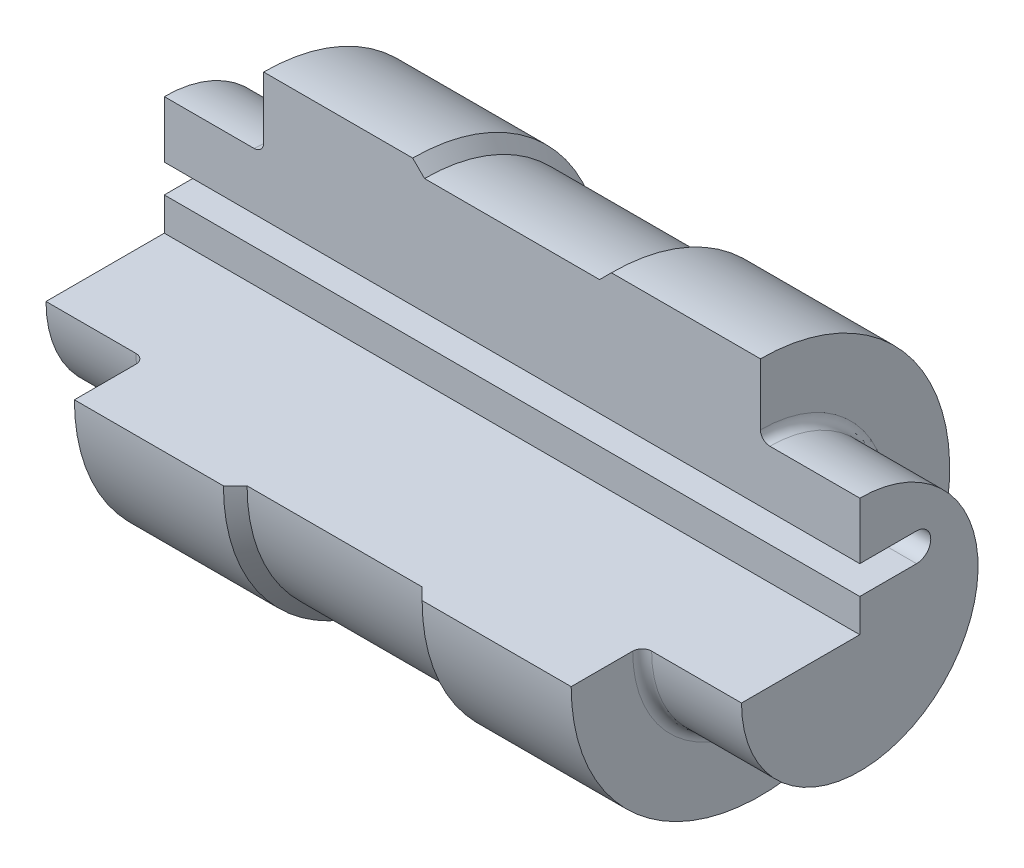
ISO-10303-21;
HEADER;
FILE_DESCRIPTION(('STEP AP214'),'2;1');
FILE_NAME('part.step','',(''),(''),'','','');
FILE_SCHEMA(('AUTOMOTIVE_DESIGN { 1 0 10303 214 1 1 1 1 }'));
ENDSEC;
DATA;
#1=APPLICATION_CONTEXT('core data for automotive mechanical design processes');
#2=APPLICATION_PROTOCOL_DEFINITION('international standard','automotive_design',2000,#1);
#3=PRODUCT_CONTEXT('',#1,'mechanical');
#4=PRODUCT('Part','Part','',(#3));
#5=PRODUCT_RELATED_PRODUCT_CATEGORY('part','',(#4));
#6=PRODUCT_DEFINITION_FORMATION('','',#4);
#7=PRODUCT_DEFINITION_CONTEXT('part definition',#1,'design');
#8=PRODUCT_DEFINITION('design','',#6,#7);
#9=PRODUCT_DEFINITION_SHAPE('','',#8);
#10=(LENGTH_UNIT() NAMED_UNIT(*) SI_UNIT(.MILLI.,.METRE.));
#11=(NAMED_UNIT(*) PLANE_ANGLE_UNIT() SI_UNIT($,.RADIAN.));
#12=(NAMED_UNIT(*) SI_UNIT($,.STERADIAN.) SOLID_ANGLE_UNIT());
#13=UNCERTAINTY_MEASURE_WITH_UNIT(LENGTH_MEASURE(1.E-05),#10,'distance_accuracy_value','');
#14=(GEOMETRIC_REPRESENTATION_CONTEXT(3) GLOBAL_UNCERTAINTY_ASSIGNED_CONTEXT((#13)) GLOBAL_UNIT_ASSIGNED_CONTEXT((#10,
#11,#12)) REPRESENTATION_CONTEXT('',''));
#15=CARTESIAN_POINT('',(0.,0.,0.));
#16=DIRECTION('',(0.,0.,1.));
#17=DIRECTION('',(1.,0.,0.));
#18=AXIS2_PLACEMENT_3D('',#15,#16,#17);
#19=CARTESIAN_POINT('',(0.,0.,0.));
#20=DIRECTION('',(0.,0.,-1.));
#21=DIRECTION('',(-1.,0.,0.));
#22=AXIS2_PLACEMENT_3D('',#19,#20,#21);
#23=PLANE('',#22);
#24=DIRECTION('',(0.,-1.,0.));
#25=VECTOR('',#24,1.);
#26=CARTESIAN_POINT('',(-117.728055077453,0.,0.));
#27=LINE('',#26,#25);
#28=CARTESIAN_POINT('',(-117.728055077453,25.,0.));
#29=VERTEX_POINT('',#28);
#30=CARTESIAN_POINT('',(-117.728055077453,13.,0.));
#31=VERTEX_POINT('',#30);
#32=EDGE_CURVE('E243',#29,#31,#27,.T.);
#33=ORIENTED_EDGE('',*,*,#32,.T.);
#34=DIRECTION('',(-1.,0.,0.));
#35=VECTOR('',#34,1.);
#36=CARTESIAN_POINT('',(29.2719449225473,13.,0.));
#37=LINE('',#36,#35);
#38=CARTESIAN_POINT('',(29.2719449225473,13.,0.));
#39=VERTEX_POINT('',#38);
#40=EDGE_CURVE('E194',#39,#31,#37,.T.);
#41=ORIENTED_EDGE('',*,*,#40,.F.);
#42=DIRECTION('',(0.,1.,0.));
#43=VECTOR('',#42,1.);
#44=CARTESIAN_POINT('',(29.2719449225473,25.,0.));
#45=LINE('',#44,#43);
#46=CARTESIAN_POINT('',(29.2719449225473,25.,0.));
#47=VERTEX_POINT('',#46);
#48=EDGE_CURVE('E207',#39,#47,#45,.T.);
#49=ORIENTED_EDGE('',*,*,#48,.T.);
#50=DIRECTION('',(-1.,0.,0.));
#51=VECTOR('',#50,1.);
#52=CARTESIAN_POINT('',(8.27194492254729,25.,0.));
#53=LINE('',#52,#51);
#54=CARTESIAN_POINT('',(10.2719449225473,25.,0.));
#55=VERTEX_POINT('',#54);
#56=EDGE_CURVE('E206',#47,#55,#53,.T.);
#57=ORIENTED_EDGE('',*,*,#56,.T.);
#58=CARTESIAN_POINT('',(10.2719449225473,27.,0.));
#59=DIRECTION('',(0.,0.,-1.));
#60=DIRECTION('',(-1.,0.,0.));
#61=AXIS2_PLACEMENT_3D('',#58,#59,#60);
#62=CIRCLE('',#61,2.);
#63=CARTESIAN_POINT('',(8.27194492254729,27.,0.));
#64=VERTEX_POINT('',#63);
#65=EDGE_CURVE('E336',#55,#64,#62,.T.);
#66=ORIENTED_EDGE('',*,*,#65,.T.);
#67=DIRECTION('',(0.,1.,0.));
#68=VECTOR('',#67,1.);
#69=CARTESIAN_POINT('',(8.27194492254729,40.,0.));
#70=LINE('',#69,#68);
#71=CARTESIAN_POINT('',(8.27194492254729,40.,0.));
#72=VERTEX_POINT('',#71);
#73=EDGE_CURVE('E211',#64,#72,#70,.T.);
#74=ORIENTED_EDGE('',*,*,#73,.T.);
#75=DIRECTION('',(-1.,0.,0.));
#76=VECTOR('',#75,1.);
#77=CARTESIAN_POINT('',(-23.2280550774527,40.,0.));
#78=LINE('',#77,#76);
#79=CARTESIAN_POINT('',(-23.2280550774527,40.,0.));
#80=VERTEX_POINT('',#79);
#81=EDGE_CURVE('E214',#72,#80,#78,.T.);
#82=ORIENTED_EDGE('',*,*,#81,.T.);
#83=DIRECTION('',(-0.707106781186544,-0.707106781186551,0.));
#84=VECTOR('',#83,1.);
#85=CARTESIAN_POINT('',(-25.7280550774527,37.5,0.));
#86=LINE('',#85,#84);
#87=CARTESIAN_POINT('',(-25.7280550774527,37.5,0.));
#88=VERTEX_POINT('',#87);
#89=EDGE_CURVE('E218',#80,#88,#86,.T.);
#90=ORIENTED_EDGE('',*,*,#89,.T.);
#91=DIRECTION('',(-1.,0.,0.));
#92=VECTOR('',#91,1.);
#93=CARTESIAN_POINT('',(-62.7280550774527,37.5,0.));
#94=LINE('',#93,#92);
#95=CARTESIAN_POINT('',(-62.7280550774527,37.5,0.));
#96=VERTEX_POINT('',#95);
#97=EDGE_CURVE('E222',#88,#96,#94,.T.);
#98=ORIENTED_EDGE('',*,*,#97,.T.);
#99=DIRECTION('',(-0.707106781186547,0.707106781186547,0.));
#100=VECTOR('',#99,1.);
#101=CARTESIAN_POINT('',(-65.2280550774527,40.,0.));
#102=LINE('',#101,#100);
#103=CARTESIAN_POINT('',(-65.2280550774527,40.,0.));
#104=VERTEX_POINT('',#103);
#105=EDGE_CURVE('E226',#96,#104,#102,.T.);
#106=ORIENTED_EDGE('',*,*,#105,.T.);
#107=DIRECTION('',(-1.,0.,0.));
#108=VECTOR('',#107,1.);
#109=CARTESIAN_POINT('',(-96.7280550774527,40.,0.));
#110=LINE('',#109,#108);
#111=CARTESIAN_POINT('',(-96.7280550774527,40.,0.));
#112=VERTEX_POINT('',#111);
#113=EDGE_CURVE('E230',#104,#112,#110,.T.);
#114=ORIENTED_EDGE('',*,*,#113,.T.);
#115=DIRECTION('',(0.,-1.,0.));
#116=VECTOR('',#115,1.);
#117=CARTESIAN_POINT('',(-96.7280550774527,25.,0.));
#118=LINE('',#117,#116);
#119=CARTESIAN_POINT('',(-96.7280550774527,27.,0.));
#120=VERTEX_POINT('',#119);
#121=EDGE_CURVE('E234',#112,#120,#118,.T.);
#122=ORIENTED_EDGE('',*,*,#121,.T.);
#123=CARTESIAN_POINT('',(-98.7280550774527,27.,0.));
#124=DIRECTION('',(0.,0.,-1.));
#125=DIRECTION('',(-1.,0.,0.));
#126=AXIS2_PLACEMENT_3D('',#123,#124,#125);
#127=CIRCLE('',#126,2.);
#128=CARTESIAN_POINT('',(-98.7280550774527,25.,0.));
#129=VERTEX_POINT('',#128);
#130=EDGE_CURVE('E54',#120,#129,#127,.T.);
#131=ORIENTED_EDGE('',*,*,#130,.T.);
#132=DIRECTION('',(-1.,0.,0.));
#133=VECTOR('',#132,1.);
#134=CARTESIAN_POINT('',(-117.728055077453,25.,0.));
#135=LINE('',#134,#133);
#136=EDGE_CURVE('E237',#129,#29,#135,.T.);
#137=ORIENTED_EDGE('',*,*,#136,.T.);
#138=EDGE_LOOP('',(#33,#41,#49,#57,#66,#74,#82,#90,#98,#106,#114,#122,#131,#137));
#139=FACE_BOUND('',#138,.T.);
#140=ADVANCED_FACE('F45',(#139),#23,.F.);
#141=CARTESIAN_POINT('',(-117.728055077453,0.,0.));
#142=DIRECTION('',(-1.,0.,0.));
#143=DIRECTION('',(0.,0.,1.));
#144=AXIS2_PLACEMENT_3D('',#141,#142,#143);
#145=PLANE('',#144);
#146=DIRECTION('',(0.,0.,1.));
#147=VECTOR('',#146,1.);
#148=CARTESIAN_POINT('',(-117.728055077453,13.,-12.));
#149=LINE('',#148,#147);
#150=CARTESIAN_POINT('',(-117.728055077453,13.,-12.));
#151=VERTEX_POINT('',#150);
#152=EDGE_CURVE('E319',#31,#151,#149,.F.);
#153=ORIENTED_EDGE('',*,*,#152,.F.);
#154=ORIENTED_EDGE('',*,*,#32,.F.);
#155=CARTESIAN_POINT('',(-117.728055077453,0.,0.));
#156=DIRECTION('',(1.,0.,0.));
#157=DIRECTION('',(0.,0.,-1.));
#158=AXIS2_PLACEMENT_3D('',#155,#156,#157);
#159=CIRCLE('',#158,25.);
#160=CARTESIAN_POINT('',(-117.728055077453,2.61861100413235E-13,25.));
#161=VERTEX_POINT('',#160);
#162=EDGE_CURVE('E312',#161,#29,#159,.T.);
#163=ORIENTED_EDGE('',*,*,#162,.F.);
#164=DIRECTION('',(0.,0.,-1.));
#165=VECTOR('',#164,1.);
#166=CARTESIAN_POINT('',(-117.728055077453,0.,0.));
#167=LINE('',#166,#165);
#168=CARTESIAN_POINT('',(-117.728055077453,0.,0.));
#169=VERTEX_POINT('',#168);
#170=EDGE_CURVE('E285',#161,#169,#167,.T.);
#171=ORIENTED_EDGE('',*,*,#170,.T.);
#172=CARTESIAN_POINT('',(-117.728055077453,7.,0.));
#173=VERTEX_POINT('',#172);
#174=EDGE_CURVE('E240',#173,#169,#27,.T.);
#175=ORIENTED_EDGE('',*,*,#174,.F.);
#176=DIRECTION('',(0.,0.,-1.));
#177=VECTOR('',#176,1.);
#178=CARTESIAN_POINT('',(-117.728055077453,7.,-12.));
#179=LINE('',#178,#177);
#180=CARTESIAN_POINT('',(-117.728055077453,7.,-12.));
#181=VERTEX_POINT('',#180);
#182=EDGE_CURVE('E199',#181,#173,#179,.F.);
#183=ORIENTED_EDGE('',*,*,#182,.F.);
#184=CARTESIAN_POINT('',(-117.728055077453,10.,-12.));
#185=DIRECTION('',(-1.,0.,0.));
#186=DIRECTION('',(0.,0.,1.));
#187=AXIS2_PLACEMENT_3D('',#184,#185,#186);
#188=CIRCLE('',#187,3.);
#189=EDGE_CURVE('E171',#151,#181,#188,.T.);
#190=ORIENTED_EDGE('',*,*,#189,.F.);
#191=EDGE_LOOP('',(#153,#154,#163,#171,#175,#183,#190));
#192=FACE_BOUND('',#191,.T.);
#193=ADVANCED_FACE('F397',(#192),#145,.T.);
#194=CARTESIAN_POINT('',(0.,0.,0.));
#195=DIRECTION('',(1.,0.,0.));
#196=DIRECTION('',(0.,0.,-1.));
#197=AXIS2_PLACEMENT_3D('',#194,#195,#196);
#198=CYLINDRICAL_SURFACE('',#197,25.);
#199=ORIENTED_EDGE('',*,*,#136,.F.);
#200=CARTESIAN_POINT('',(-98.7280550774527,0.,0.));
#201=DIRECTION('',(-1.,0.,0.));
#202=DIRECTION('',(0.,0.,1.));
#203=AXIS2_PLACEMENT_3D('',#200,#201,#202);
#204=CIRCLE('',#203,25.);
#205=CARTESIAN_POINT('',(-98.7280550774527,2.61861100413235E-13,25.));
#206=VERTEX_POINT('',#205);
#207=EDGE_CURVE('E67',#129,#206,#204,.T.);
#208=ORIENTED_EDGE('',*,*,#207,.T.);
#209=DIRECTION('',(-1.,0.,0.));
#210=VECTOR('',#209,1.);
#211=CARTESIAN_POINT('',(-117.728055077453,2.61861100413235E-13,25.));
#212=LINE('',#211,#210);
#213=EDGE_CURVE('E282',#206,#161,#212,.T.);
#214=ORIENTED_EDGE('',*,*,#213,.T.);
#215=ORIENTED_EDGE('',*,*,#162,.T.);
#216=EDGE_LOOP('',(#199,#208,#214,#215));
#217=FACE_BOUND('',#216,.T.);
#218=ADVANCED_FACE('F393',(#217),#198,.T.);
#219=CARTESIAN_POINT('',(-96.7280550774527,2.61861100413235E-13,25.));
#220=DIRECTION('',(-1.,0.,0.));
#221=DIRECTION('',(0.,0.,1.));
#222=AXIS2_PLACEMENT_3D('',#219,#220,#221);
#223=PLANE('',#222);
#224=DIRECTION('',(0.,0.,-1.));
#225=VECTOR('',#224,1.);
#226=CARTESIAN_POINT('',(-96.7280550774527,2.61861100413235E-13,25.));
#227=LINE('',#226,#225);
#228=CARTESIAN_POINT('',(-96.7280550774527,4.18977760661176E-13,40.));
#229=VERTEX_POINT('',#228);
#230=CARTESIAN_POINT('',(-96.7280550774527,2.82809988446294E-13,27.));
#231=VERTEX_POINT('',#230);
#232=EDGE_CURVE('E278',#229,#231,#227,.T.);
#233=ORIENTED_EDGE('',*,*,#232,.T.);
#234=CARTESIAN_POINT('',(-96.7280550774527,0.,0.));
#235=DIRECTION('',(-1.,0.,0.));
#236=DIRECTION('',(0.,0.,1.));
#237=AXIS2_PLACEMENT_3D('',#234,#235,#236);
#238=CIRCLE('',#237,27.);
#239=EDGE_CURVE('E330',#231,#120,#238,.F.);
#240=ORIENTED_EDGE('',*,*,#239,.T.);
#241=ORIENTED_EDGE('',*,*,#121,.F.);
#242=CARTESIAN_POINT('',(-96.7280550774527,0.,0.));
#243=DIRECTION('',(1.,0.,0.));
#244=DIRECTION('',(0.,0.,-1.));
#245=AXIS2_PLACEMENT_3D('',#242,#243,#244);
#246=CIRCLE('',#245,40.);
#247=EDGE_CURVE('E309',#229,#112,#246,.T.);
#248=ORIENTED_EDGE('',*,*,#247,.F.);
#249=EDGE_LOOP('',(#233,#240,#241,#248));
#250=FACE_BOUND('',#249,.T.);
#251=ADVANCED_FACE('F384',(#250),#223,.T.);
#252=CARTESIAN_POINT('',(0.,0.,0.));
#253=DIRECTION('',(1.,0.,0.));
#254=DIRECTION('',(0.,0.,-1.));
#255=AXIS2_PLACEMENT_3D('',#252,#253,#254);
#256=CYLINDRICAL_SURFACE('',#255,40.);
#257=CARTESIAN_POINT('',(-65.2280550774527,0.,0.));
#258=DIRECTION('',(1.,0.,0.));
#259=DIRECTION('',(0.,0.,-1.));
#260=AXIS2_PLACEMENT_3D('',#257,#258,#259);
#261=CIRCLE('',#260,40.);
#262=CARTESIAN_POINT('',(-65.2280550774527,4.18977760661176E-13,40.));
#263=VERTEX_POINT('',#262);
#264=EDGE_CURVE('E306',#263,#104,#261,.T.);
#265=ORIENTED_EDGE('',*,*,#264,.F.);
#266=DIRECTION('',(-1.,0.,0.));
#267=VECTOR('',#266,1.);
#268=CARTESIAN_POINT('',(-96.7280550774527,4.18977760661176E-13,40.));
#269=LINE('',#268,#267);
#270=EDGE_CURVE('E274',#263,#229,#269,.T.);
#271=ORIENTED_EDGE('',*,*,#270,.T.);
#272=ORIENTED_EDGE('',*,*,#247,.T.);
#273=ORIENTED_EDGE('',*,*,#113,.F.);
#274=EDGE_LOOP('',(#265,#271,#272,#273));
#275=FACE_BOUND('',#274,.T.);
#276=ADVANCED_FACE('F380',(#275),#256,.T.);
#277=CARTESIAN_POINT('',(-62.7280550774527,0.,0.));
#278=DIRECTION('',(-1.,0.,0.));
#279=DIRECTION('',(0.,0.,1.));
#280=AXIS2_PLACEMENT_3D('',#277,#278,#279);
#281=CONICAL_SURFACE('',#280,37.5,0.785398163397448);
#282=CARTESIAN_POINT('',(-62.7280550774527,0.,0.));
#283=DIRECTION('',(1.,0.,0.));
#284=DIRECTION('',(0.,0.,-1.));
#285=AXIS2_PLACEMENT_3D('',#282,#283,#284);
#286=CIRCLE('',#285,37.5);
#287=CARTESIAN_POINT('',(-62.7280550774527,3.92791650619852E-13,37.5));
#288=VERTEX_POINT('',#287);
#289=EDGE_CURVE('E303',#288,#96,#286,.T.);
#290=ORIENTED_EDGE('',*,*,#289,.F.);
#291=DIRECTION('',(-0.707106781186547,0.,0.707106781186547));
#292=VECTOR('',#291,1.);
#293=CARTESIAN_POINT('',(-65.2280550774527,4.18977760661176E-13,40.));
#294=LINE('',#293,#292);
#295=EDGE_CURVE('E270',#288,#263,#294,.T.);
#296=ORIENTED_EDGE('',*,*,#295,.T.);
#297=ORIENTED_EDGE('',*,*,#264,.T.);
#298=ORIENTED_EDGE('',*,*,#105,.F.);
#299=EDGE_LOOP('',(#290,#296,#297,#298));
#300=FACE_BOUND('',#299,.T.);
#301=ADVANCED_FACE('F377',(#300),#281,.T.);
#302=CARTESIAN_POINT('',(0.,0.,0.));
#303=DIRECTION('',(1.,0.,0.));
#304=DIRECTION('',(0.,0.,-1.));
#305=AXIS2_PLACEMENT_3D('',#302,#303,#304);
#306=CYLINDRICAL_SURFACE('',#305,37.5);
#307=CARTESIAN_POINT('',(-25.7280550774527,0.,0.));
#308=DIRECTION('',(1.,0.,0.));
#309=DIRECTION('',(0.,0.,-1.));
#310=AXIS2_PLACEMENT_3D('',#307,#308,#309);
#311=CIRCLE('',#310,37.5);
#312=CARTESIAN_POINT('',(-25.7280550774527,3.92791650619852E-13,37.5));
#313=VERTEX_POINT('',#312);
#314=EDGE_CURVE('E300',#313,#88,#311,.T.);
#315=ORIENTED_EDGE('',*,*,#314,.F.);
#316=DIRECTION('',(-1.,0.,0.));
#317=VECTOR('',#316,1.);
#318=CARTESIAN_POINT('',(-62.7280550774527,3.92791650619852E-13,37.5));
#319=LINE('',#318,#317);
#320=EDGE_CURVE('E266',#313,#288,#319,.T.);
#321=ORIENTED_EDGE('',*,*,#320,.T.);
#322=ORIENTED_EDGE('',*,*,#289,.T.);
#323=ORIENTED_EDGE('',*,*,#97,.F.);
#324=EDGE_LOOP('',(#315,#321,#322,#323));
#325=FACE_BOUND('',#324,.T.);
#326=ADVANCED_FACE('F372',(#325),#306,.T.);
#327=CARTESIAN_POINT('',(-23.2280550774527,0.,0.));
#328=DIRECTION('',(1.,0.,0.));
#329=DIRECTION('',(0.,0.,-1.));
#330=AXIS2_PLACEMENT_3D('',#327,#328,#329);
#331=CONICAL_SURFACE('',#330,40.,0.785398163397453);
#332=CARTESIAN_POINT('',(-23.2280550774527,0.,0.));
#333=DIRECTION('',(1.,0.,0.));
#334=DIRECTION('',(0.,0.,-1.));
#335=AXIS2_PLACEMENT_3D('',#332,#333,#334);
#336=CIRCLE('',#335,40.);
#337=CARTESIAN_POINT('',(-23.2280550774527,4.18977760661176E-13,40.));
#338=VERTEX_POINT('',#337);
#339=EDGE_CURVE('E297',#338,#80,#336,.T.);
#340=ORIENTED_EDGE('',*,*,#339,.F.);
#341=DIRECTION('',(-0.707106781186544,0.,-0.707106781186551));
#342=VECTOR('',#341,1.);
#343=CARTESIAN_POINT('',(-25.7280550774527,3.92791650619852E-13,37.5));
#344=LINE('',#343,#342);
#345=EDGE_CURVE('E262',#338,#313,#344,.T.);
#346=ORIENTED_EDGE('',*,*,#345,.T.);
#347=ORIENTED_EDGE('',*,*,#314,.T.);
#348=ORIENTED_EDGE('',*,*,#89,.F.);
#349=EDGE_LOOP('',(#340,#346,#347,#348));
#350=FACE_BOUND('',#349,.T.);
#351=ADVANCED_FACE('F368',(#350),#331,.T.);
#352=CARTESIAN_POINT('',(0.,0.,0.));
#353=DIRECTION('',(1.,0.,0.));
#354=DIRECTION('',(0.,0.,-1.));
#355=AXIS2_PLACEMENT_3D('',#352,#353,#354);
#356=CYLINDRICAL_SURFACE('',#355,40.);
#357=CARTESIAN_POINT('',(8.27194492254729,0.,0.));
#358=DIRECTION('',(1.,0.,0.));
#359=DIRECTION('',(0.,0.,-1.));
#360=AXIS2_PLACEMENT_3D('',#357,#358,#359);
#361=CIRCLE('',#360,40.);
#362=CARTESIAN_POINT('',(8.27194492254729,4.18977760661176E-13,40.));
#363=VERTEX_POINT('',#362);
#364=EDGE_CURVE('E293',#363,#72,#361,.T.);
#365=ORIENTED_EDGE('',*,*,#364,.F.);
#366=DIRECTION('',(-1.,0.,0.));
#367=VECTOR('',#366,1.);
#368=CARTESIAN_POINT('',(-23.2280550774527,4.18977760661176E-13,40.));
#369=LINE('',#368,#367);
#370=EDGE_CURVE('E258',#363,#338,#369,.T.);
#371=ORIENTED_EDGE('',*,*,#370,.T.);
#372=ORIENTED_EDGE('',*,*,#339,.T.);
#373=ORIENTED_EDGE('',*,*,#81,.F.);
#374=EDGE_LOOP('',(#365,#371,#372,#373));
#375=FACE_BOUND('',#374,.T.);
#376=ADVANCED_FACE('F364',(#375),#356,.T.);
#377=CARTESIAN_POINT('',(8.27194492254729,4.18977760661176E-13,40.));
#378=DIRECTION('',(1.,0.,0.));
#379=DIRECTION('',(0.,0.,-1.));
#380=AXIS2_PLACEMENT_3D('',#377,#378,#379);
#381=PLANE('',#380);
#382=ORIENTED_EDGE('',*,*,#73,.F.);
#383=CARTESIAN_POINT('',(8.27194492254729,0.,0.));
#384=DIRECTION('',(1.,0.,0.));
#385=DIRECTION('',(0.,0.,-1.));
#386=AXIS2_PLACEMENT_3D('',#383,#384,#385);
#387=CIRCLE('',#386,27.);
#388=CARTESIAN_POINT('',(8.27194492254729,2.82809988446294E-13,27.));
#389=VERTEX_POINT('',#388);
#390=EDGE_CURVE('E327',#64,#389,#387,.F.);
#391=ORIENTED_EDGE('',*,*,#390,.T.);
#392=DIRECTION('',(0.,0.,1.));
#393=VECTOR('',#392,1.);
#394=CARTESIAN_POINT('',(8.27194492254729,4.18977760661176E-13,40.));
#395=LINE('',#394,#393);
#396=EDGE_CURVE('E255',#389,#363,#395,.T.);
#397=ORIENTED_EDGE('',*,*,#396,.T.);
#398=ORIENTED_EDGE('',*,*,#364,.T.);
#399=EDGE_LOOP('',(#382,#391,#397,#398));
#400=FACE_BOUND('',#399,.T.);
#401=ADVANCED_FACE('F358',(#400),#381,.T.);
#402=CARTESIAN_POINT('',(0.,0.,0.));
#403=DIRECTION('',(1.,0.,0.));
#404=DIRECTION('',(0.,0.,-1.));
#405=AXIS2_PLACEMENT_3D('',#402,#403,#404);
#406=CYLINDRICAL_SURFACE('',#405,25.);
#407=DIRECTION('',(-1.,0.,0.));
#408=VECTOR('',#407,1.);
#409=CARTESIAN_POINT('',(8.27194492254729,2.61861100413235E-13,25.));
#410=LINE('',#409,#408);
#411=CARTESIAN_POINT('',(29.2719449225473,2.61861100413235E-13,25.));
#412=VERTEX_POINT('',#411);
#413=CARTESIAN_POINT('',(10.2719449225473,2.61861100413235E-13,25.));
#414=VERTEX_POINT('',#413);
#415=EDGE_CURVE('E251',#412,#414,#410,.T.);
#416=ORIENTED_EDGE('',*,*,#415,.T.);
#417=CARTESIAN_POINT('',(10.2719449225473,0.,0.));
#418=DIRECTION('',(1.,0.,0.));
#419=DIRECTION('',(0.,0.,-1.));
#420=AXIS2_PLACEMENT_3D('',#417,#418,#419);
#421=CIRCLE('',#420,25.);
#422=EDGE_CURVE('E316',#414,#55,#421,.T.);
#423=ORIENTED_EDGE('',*,*,#422,.T.);
#424=ORIENTED_EDGE('',*,*,#56,.F.);
#425=CARTESIAN_POINT('',(29.2719449225473,0.,0.));
#426=DIRECTION('',(1.,0.,0.));
#427=DIRECTION('',(0.,0.,-1.));
#428=AXIS2_PLACEMENT_3D('',#425,#426,#427);
#429=CIRCLE('',#428,25.);
#430=EDGE_CURVE('E289',#412,#47,#429,.T.);
#431=ORIENTED_EDGE('',*,*,#430,.F.);
#432=EDGE_LOOP('',(#416,#423,#424,#431));
#433=FACE_BOUND('',#432,.T.);
#434=ADVANCED_FACE('F350',(#433),#406,.T.);
#435=CARTESIAN_POINT('',(29.2719449225473,2.61861100413235E-13,25.));
#436=DIRECTION('',(1.,0.,0.));
#437=DIRECTION('',(0.,0.,-1.));
#438=AXIS2_PLACEMENT_3D('',#435,#436,#437);
#439=PLANE('',#438);
#440=DIRECTION('',(0.,0.,-1.));
#441=VECTOR('',#440,1.);
#442=CARTESIAN_POINT('',(29.2719449225473,13.,-12.));
#443=LINE('',#442,#441);
#444=CARTESIAN_POINT('',(29.2719449225473,13.,-12.));
#445=VERTEX_POINT('',#444);
#446=EDGE_CURVE('E176',#39,#445,#443,.T.);
#447=ORIENTED_EDGE('',*,*,#446,.T.);
#448=CARTESIAN_POINT('',(29.2719449225473,10.,-12.));
#449=DIRECTION('',(-1.,0.,0.));
#450=DIRECTION('',(0.,0.,1.));
#451=AXIS2_PLACEMENT_3D('',#448,#449,#450);
#452=CIRCLE('',#451,3.);
#453=CARTESIAN_POINT('',(29.2719449225473,7.,-12.));
#454=VERTEX_POINT('',#453);
#455=EDGE_CURVE('E168',#445,#454,#452,.T.);
#456=ORIENTED_EDGE('',*,*,#455,.T.);
#457=DIRECTION('',(0.,0.,1.));
#458=VECTOR('',#457,1.);
#459=CARTESIAN_POINT('',(29.2719449225473,7.,-12.));
#460=LINE('',#459,#458);
#461=CARTESIAN_POINT('',(29.2719449225473,7.,0.));
#462=VERTEX_POINT('',#461);
#463=EDGE_CURVE('E179',#454,#462,#460,.T.);
#464=ORIENTED_EDGE('',*,*,#463,.T.);
#465=CARTESIAN_POINT('',(29.2719449225473,0.,0.));
#466=VERTEX_POINT('',#465);
#467=EDGE_CURVE('E203',#466,#462,#45,.T.);
#468=ORIENTED_EDGE('',*,*,#467,.F.);
#469=DIRECTION('',(0.,0.,1.));
#470=VECTOR('',#469,1.);
#471=CARTESIAN_POINT('',(29.2719449225473,2.61861100413235E-13,25.));
#472=LINE('',#471,#470);
#473=EDGE_CURVE('E247',#466,#412,#472,.T.);
#474=ORIENTED_EDGE('',*,*,#473,.T.);
#475=ORIENTED_EDGE('',*,*,#430,.T.);
#476=ORIENTED_EDGE('',*,*,#48,.F.);
#477=EDGE_LOOP('',(#447,#456,#464,#468,#474,#475,#476));
#478=FACE_BOUND('',#477,.T.);
#479=ADVANCED_FACE('F187',(#478),#439,.T.);
#480=CARTESIAN_POINT('',(0.,0.,0.));
#481=DIRECTION('',(0.,1.,0.));
#482=DIRECTION('',(-1.,0.,0.));
#483=AXIS2_PLACEMENT_3D('',#480,#481,#482);
#484=PLANE('',#483);
#485=DIRECTION('',(1.,0.,0.));
#486=VECTOR('',#485,1.);
#487=CARTESIAN_POINT('',(29.2719449225473,0.,0.));
#488=LINE('',#487,#486);
#489=EDGE_CURVE('E244',#169,#466,#488,.T.);
#490=ORIENTED_EDGE('',*,*,#489,.F.);
#491=ORIENTED_EDGE('',*,*,#170,.F.);
#492=ORIENTED_EDGE('',*,*,#213,.F.);
#493=CARTESIAN_POINT('',(-98.7280550774527,2.82809988446294E-13,27.));
#494=DIRECTION('',(0.,1.,0.));
#495=DIRECTION('',(0.,0.,1.));
#496=AXIS2_PLACEMENT_3D('',#493,#494,#495);
#497=CIRCLE('',#496,2.);
#498=EDGE_CURVE('E11',#206,#231,#497,.F.);
#499=ORIENTED_EDGE('',*,*,#498,.T.);
#500=ORIENTED_EDGE('',*,*,#232,.F.);
#501=ORIENTED_EDGE('',*,*,#270,.F.);
#502=ORIENTED_EDGE('',*,*,#295,.F.);
#503=ORIENTED_EDGE('',*,*,#320,.F.);
#504=ORIENTED_EDGE('',*,*,#345,.F.);
#505=ORIENTED_EDGE('',*,*,#370,.F.);
#506=ORIENTED_EDGE('',*,*,#396,.F.);
#507=CARTESIAN_POINT('',(10.2719449225473,2.82809988446294E-13,27.));
#508=DIRECTION('',(0.,1.,0.));
#509=DIRECTION('',(0.,0.,1.));
#510=AXIS2_PLACEMENT_3D('',#507,#508,#509);
#511=CIRCLE('',#510,2.);
#512=EDGE_CURVE('E339',#389,#414,#511,.F.);
#513=ORIENTED_EDGE('',*,*,#512,.T.);
#514=ORIENTED_EDGE('',*,*,#415,.F.);
#515=ORIENTED_EDGE('',*,*,#473,.F.);
#516=EDGE_LOOP('',(#490,#491,#492,#499,#500,#501,#502,#503,#504,#505,#506,#513,#514,#515));
#517=FACE_BOUND('',#516,.T.);
#518=ADVANCED_FACE('F390',(#517),#484,.T.);
#519=ORIENTED_EDGE('',*,*,#467,.T.);
#520=DIRECTION('',(-1.,0.,0.));
#521=VECTOR('',#520,1.);
#522=CARTESIAN_POINT('',(29.2719449225473,7.,0.));
#523=LINE('',#522,#521);
#524=EDGE_CURVE('E175',#462,#173,#523,.T.);
#525=ORIENTED_EDGE('',*,*,#524,.T.);
#526=ORIENTED_EDGE('',*,*,#174,.T.);
#527=ORIENTED_EDGE('',*,*,#489,.T.);
#528=EDGE_LOOP('',(#519,#525,#526,#527));
#529=FACE_BOUND('',#528,.T.);
#530=ADVANCED_FACE('F408',(#529),#23,.F.);
#531=CARTESIAN_POINT('',(29.2719449225473,10.,-12.));
#532=DIRECTION('',(-1.,0.,0.));
#533=DIRECTION('',(0.,0.,1.));
#534=AXIS2_PLACEMENT_3D('',#531,#532,#533);
#535=CYLINDRICAL_SURFACE('',#534,3.);
#536=ORIENTED_EDGE('',*,*,#189,.T.);
#537=DIRECTION('',(-1.,0.,0.));
#538=VECTOR('',#537,1.);
#539=CARTESIAN_POINT('',(29.2719449225473,7.,-12.));
#540=LINE('',#539,#538);
#541=EDGE_CURVE('E163',#454,#181,#540,.T.);
#542=ORIENTED_EDGE('',*,*,#541,.F.);
#543=ORIENTED_EDGE('',*,*,#455,.F.);
#544=DIRECTION('',(-1.,0.,0.));
#545=VECTOR('',#544,1.);
#546=CARTESIAN_POINT('',(29.2719449225473,13.,-12.));
#547=LINE('',#546,#545);
#548=EDGE_CURVE('E197',#445,#151,#547,.T.);
#549=ORIENTED_EDGE('',*,*,#548,.T.);
#550=EDGE_LOOP('',(#536,#542,#543,#549));
#551=FACE_BOUND('',#550,.T.);
#552=ADVANCED_FACE('F165',(#551),#535,.F.);
#553=CARTESIAN_POINT('',(29.2719449225473,13.,-12.));
#554=DIRECTION('',(0.,1.,0.));
#555=DIRECTION('',(0.,0.,1.));
#556=AXIS2_PLACEMENT_3D('',#553,#554,#555);
#557=PLANE('',#556);
#558=ORIENTED_EDGE('',*,*,#152,.T.);
#559=ORIENTED_EDGE('',*,*,#548,.F.);
#560=ORIENTED_EDGE('',*,*,#446,.F.);
#561=ORIENTED_EDGE('',*,*,#40,.T.);
#562=EDGE_LOOP('',(#558,#559,#560,#561));
#563=FACE_BOUND('',#562,.T.);
#564=ADVANCED_FACE('F400',(#563),#557,.F.);
#565=CARTESIAN_POINT('',(29.2719449225473,7.,-12.));
#566=DIRECTION('',(0.,-1.,0.));
#567=DIRECTION('',(0.,0.,-1.));
#568=AXIS2_PLACEMENT_3D('',#565,#566,#567);
#569=PLANE('',#568);
#570=ORIENTED_EDGE('',*,*,#182,.T.);
#571=ORIENTED_EDGE('',*,*,#524,.F.);
#572=ORIENTED_EDGE('',*,*,#463,.F.);
#573=ORIENTED_EDGE('',*,*,#541,.T.);
#574=EDGE_LOOP('',(#570,#571,#572,#573));
#575=FACE_BOUND('',#574,.T.);
#576=ADVANCED_FACE('F180',(#575),#569,.F.);
#577=CARTESIAN_POINT('',(10.2719449225473,0.,0.));
#578=DIRECTION('',(1.,0.,0.));
#579=DIRECTION('',(0.,0.,-1.));
#580=AXIS2_PLACEMENT_3D('',#577,#578,#579);
#581=TOROIDAL_SURFACE('',#580,27.,2.);
#582=ORIENTED_EDGE('',*,*,#512,.F.);
#583=ORIENTED_EDGE('',*,*,#390,.F.);
#584=ORIENTED_EDGE('',*,*,#65,.F.);
#585=ORIENTED_EDGE('',*,*,#422,.F.);
#586=EDGE_LOOP('',(#582,#583,#584,#585));
#587=FACE_BOUND('',#586,.T.);
#588=ADVANCED_FACE('F354',(#587),#581,.F.);
#589=CARTESIAN_POINT('',(-98.7280550774527,0.,0.));
#590=DIRECTION('',(-1.,0.,0.));
#591=DIRECTION('',(0.,0.,1.));
#592=AXIS2_PLACEMENT_3D('',#589,#590,#591);
#593=TOROIDAL_SURFACE('',#592,27.,2.);
#594=ORIENTED_EDGE('',*,*,#498,.F.);
#595=ORIENTED_EDGE('',*,*,#207,.F.);
#596=ORIENTED_EDGE('',*,*,#130,.F.);
#597=ORIENTED_EDGE('',*,*,#239,.F.);
#598=EDGE_LOOP('',(#594,#595,#596,#597));
#599=FACE_BOUND('',#598,.T.);
#600=ADVANCED_FACE('F47',(#599),#593,.F.);
#601=CLOSED_SHELL('',(#140,#193,#218,#251,#276,#301,#326,#351,#376,#401,#434,#479,#518,#530,
#552,#564,#576,#588,#600));
#602=MANIFOLD_SOLID_BREP('B2',#601);
#603=ADVANCED_BREP_SHAPE_REPRESENTATION('',(#18,#602),#14);
#604=SHAPE_DEFINITION_REPRESENTATION(#9,#603);
ENDSEC;
END-ISO-10303-21;
